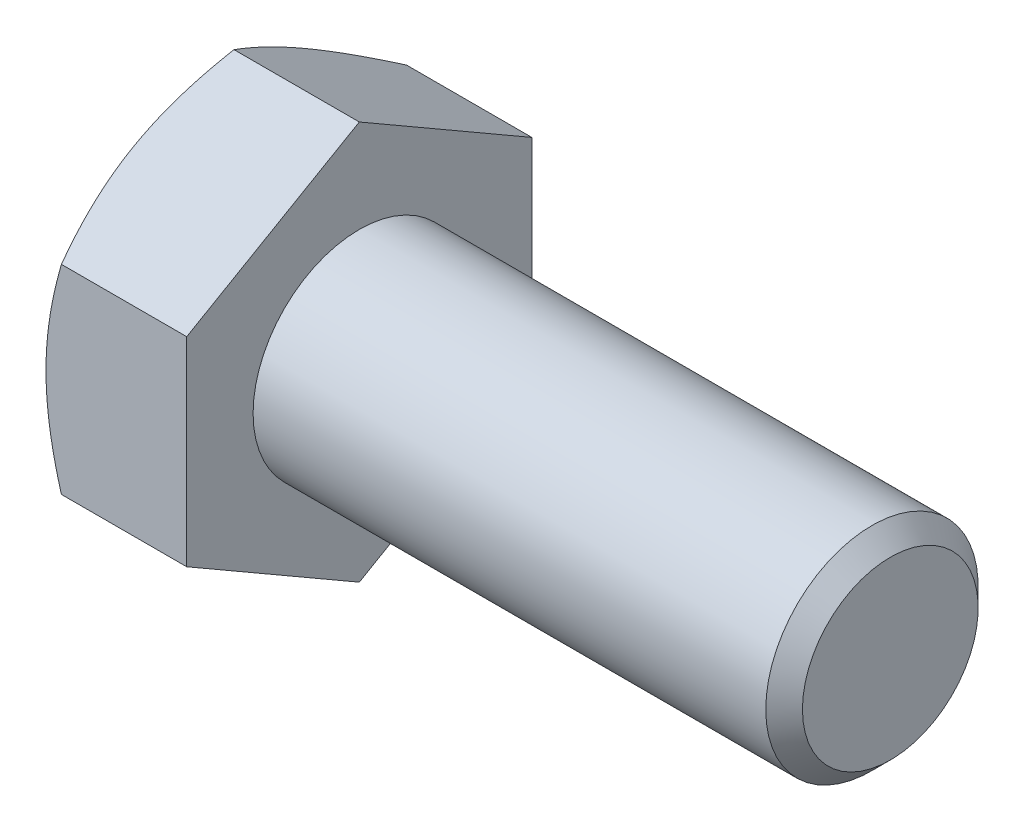
ISO-10303-21;
HEADER;
FILE_DESCRIPTION(('STEP AP214'),'2;1');
FILE_NAME('part.step','',(''),(''),'','','');
FILE_SCHEMA(('AUTOMOTIVE_DESIGN { 1 0 10303 214 1 1 1 1 }'));
ENDSEC;
DATA;
#1=APPLICATION_CONTEXT('core data for automotive mechanical design processes');
#2=APPLICATION_PROTOCOL_DEFINITION('international standard','automotive_design',2000,#1);
#3=PRODUCT_CONTEXT('',#1,'mechanical');
#4=PRODUCT('Part','Part','',(#3));
#5=PRODUCT_RELATED_PRODUCT_CATEGORY('part','',(#4));
#6=PRODUCT_DEFINITION_FORMATION('','',#4);
#7=PRODUCT_DEFINITION_CONTEXT('part definition',#1,'design');
#8=PRODUCT_DEFINITION('design','',#6,#7);
#9=PRODUCT_DEFINITION_SHAPE('','',#8);
#10=(LENGTH_UNIT() NAMED_UNIT(*) SI_UNIT(.MILLI.,.METRE.));
#11=(NAMED_UNIT(*) PLANE_ANGLE_UNIT() SI_UNIT($,.RADIAN.));
#12=(NAMED_UNIT(*) SI_UNIT($,.STERADIAN.) SOLID_ANGLE_UNIT());
#13=UNCERTAINTY_MEASURE_WITH_UNIT(LENGTH_MEASURE(1.E-05),#10,'distance_accuracy_value','');
#14=(GEOMETRIC_REPRESENTATION_CONTEXT(3) GLOBAL_UNCERTAINTY_ASSIGNED_CONTEXT((#13)) GLOBAL_UNIT_ASSIGNED_CONTEXT((#10,
#11,#12)) REPRESENTATION_CONTEXT('',''));
#15=CARTESIAN_POINT('',(0.,0.,0.));
#16=DIRECTION('',(0.,0.,1.));
#17=DIRECTION('',(1.,0.,0.));
#18=AXIS2_PLACEMENT_3D('',#15,#16,#17);
#19=CARTESIAN_POINT('',(5.3,3.75277674973256,-6.5));
#20=DIRECTION('',(0.,-0.866025403784438,0.500000000000001));
#21=DIRECTION('',(0.,-0.500000000000001,-0.866025403784438));
#22=AXIS2_PLACEMENT_3D('',#19,#20,#21);
#23=PLANE('',#22);
#24=CARTESIAN_POINT('',(0.580623251805871,7.50566896951898,0.0002));
#25=CARTESIAN_POINT('',(0.533004423075489,7.4231786300702,-0.14267745905888));
#26=CARTESIAN_POINT('',(0.48754670060271,7.34038072665459,-0.286087634534912));
#27=CARTESIAN_POINT('',(0.401548682023049,7.17411251123976,-0.574072631317194));
#28=CARTESIAN_POINT('',(0.361010507228028,7.09064192560665,-0.718647926571263));
#29=CARTESIAN_POINT('',(0.247571001123211,6.83889369625719,-1.15468865052003));
#30=CARTESIAN_POINT('',(0.183047807128741,6.66962231516081,-1.44787528284632));
#31=CARTESIAN_POINT('',(0.107386583547493,6.41631077211555,-1.88662374554437));
#32=CARTESIAN_POINT('',(0.0858328564569893,6.33302748139455,-2.03087463649469));
#33=CARTESIAN_POINT('',(0.0496903146061205,6.16608458377293,-2.32002821713809));
#34=CARTESIAN_POINT('',(0.0351008844596677,6.08242501078143,-2.46493084809889));
#35=CARTESIAN_POINT('',(0.0132587525073475,5.91496056339807,-2.75498777942832));
#36=CARTESIAN_POINT('',(0.00599772432210858,5.8311559625217,-2.90014160605421));
#37=CARTESIAN_POINT('',(-0.00103969741776807,5.66347396979287,-3.19057533697495));
#38=CARTESIAN_POINT('',(-0.000816322187795094,5.5795965802691,-3.33585523723636));
#39=CARTESIAN_POINT('',(0.010083458515165,5.34979921898453,-3.73387594242649));
#40=CARTESIAN_POINT('',(0.028381817869413,5.20395446807007,-3.98648646102757));
#41=CARTESIAN_POINT('',(0.0864063414576745,4.91323365606635,-4.49002967823568));
#42=CARTESIAN_POINT('',(0.126152338538244,4.76835861741226,-4.74096060593308));
#43=CARTESIAN_POINT('',(0.225505903202148,4.47705272008731,-5.24551722064432));
#44=CARTESIAN_POINT('',(0.285534425638025,4.33065861912702,-5.49907924143591));
#45=CARTESIAN_POINT('',(0.421774992509866,4.04005357906493,-6.00242193575904));
#46=CARTESIAN_POINT('',(0.49795503416359,3.89583891821181,-6.25220905555296));
#47=CARTESIAN_POINT('',(0.580623251805864,3.75266127967872,-6.5002));
#48=B_SPLINE_CURVE_WITH_KNOTS('',3,(#24,#25,#26,#27,#28,#29,#30,#31,#32,#33,#34,#35,#36,#37,#38,
#39,#40,#41,#42,#43,#44,#45,#46,#47),.UNSPECIFIED.,.F.,.F.,(4,2,2,2,2,2,2,2,2,2,2,4),(0.,
0.515105052395588,1.03043143507525,2.06322554824262,2.56697389547997,3.07067772176454,
3.57380860368928,4.0769239424252,4.9527935470566,5.82947446853467,6.72559912449737,
7.61996451221046),.UNSPECIFIED.);
#49=CARTESIAN_POINT('',(0.580556583600767,7.50555349946514,0.));
#50=VERTEX_POINT('',#49);
#51=CARTESIAN_POINT('',(0.,5.62916512459884,-3.25000000000001));
#52=VERTEX_POINT('',#51);
#53=EDGE_CURVE('E51',#50,#52,#48,.T.);
#54=ORIENTED_EDGE('',*,*,#53,.F.);
#55=DIRECTION('',(-1.,0.,0.));
#56=VECTOR('',#55,1.);
#57=CARTESIAN_POINT('',(5.3,7.50555349946514,0.));
#58=LINE('',#57,#56);
#59=CARTESIAN_POINT('',(5.3,7.50555349946514,0.));
#60=VERTEX_POINT('',#59);
#61=EDGE_CURVE('E147',#60,#50,#58,.T.);
#62=ORIENTED_EDGE('',*,*,#61,.F.);
#63=DIRECTION('',(0.,0.500000000000001,0.866025403784438));
#64=VECTOR('',#63,1.);
#65=CARTESIAN_POINT('',(5.3,3.75277674973256,-6.5));
#66=LINE('',#65,#64);
#67=CARTESIAN_POINT('',(5.3,3.75277674973256,-6.5));
#68=VERTEX_POINT('',#67);
#69=EDGE_CURVE('E238',#68,#60,#66,.T.);
#70=ORIENTED_EDGE('',*,*,#69,.F.);
#71=DIRECTION('',(-1.,0.,0.));
#72=VECTOR('',#71,1.);
#73=CARTESIAN_POINT('',(5.3,3.75277674973256,-6.5));
#74=LINE('',#73,#72);
#75=CARTESIAN_POINT('',(0.580556583600761,3.75277674973256,-6.5));
#76=VERTEX_POINT('',#75);
#77=EDGE_CURVE('E135',#68,#76,#74,.T.);
#78=ORIENTED_EDGE('',*,*,#77,.T.);
#79=EDGE_CURVE('E129',#52,#76,#48,.T.);
#80=ORIENTED_EDGE('',*,*,#79,.F.);
#81=EDGE_LOOP('',(#54,#62,#70,#78,#80));
#82=FACE_BOUND('',#81,.T.);
#83=ADVANCED_FACE('F35',(#82),#23,.F.);
#84=CARTESIAN_POINT('',(5.3,7.50555349946514,0.));
#85=DIRECTION('',(0.,-0.866025403784438,-0.500000000000001));
#86=DIRECTION('',(0.,0.500000000000001,-0.866025403784438));
#87=AXIS2_PLACEMENT_3D('',#84,#85,#86);
#88=PLANE('',#87);
#89=CARTESIAN_POINT('',(0.580623251805867,3.75266127967873,6.5002));
#90=CARTESIAN_POINT('',(0.533004423075485,3.83515161912751,6.35732254094112));
#91=CARTESIAN_POINT('',(0.487546700602706,3.91794952254312,6.21391236546508));
#92=CARTESIAN_POINT('',(0.401548682023045,4.08421773795795,5.9259273686828));
#93=CARTESIAN_POINT('',(0.361010507228025,4.16768832359106,5.78135207342873));
#94=CARTESIAN_POINT('',(0.247571001123208,4.41943655294052,5.34531134947996));
#95=CARTESIAN_POINT('',(0.18304780712874,4.5887079340369,5.05212471715368));
#96=CARTESIAN_POINT('',(0.107386583547492,4.84201947708216,4.61337625445562));
#97=CARTESIAN_POINT('',(0.0858328564569885,4.92530276780316,4.46912536350531));
#98=CARTESIAN_POINT('',(0.0496903146061203,5.09224566542477,4.17997178286191));
#99=CARTESIAN_POINT('',(0.0351008844596681,5.17590523841628,4.03506915190111));
#100=CARTESIAN_POINT('',(0.0132587525073484,5.34336968579964,3.74501222057168));
#101=CARTESIAN_POINT('',(0.00599772432210927,5.427174286676,3.59985839394579));
#102=CARTESIAN_POINT('',(-0.00103969741776701,5.59485627940484,3.30942466302505));
#103=CARTESIAN_POINT('',(-0.000816322187793485,5.67873366892861,3.16414476276364));
#104=CARTESIAN_POINT('',(0.0100834585151677,5.90853103021318,2.76612405757351));
#105=CARTESIAN_POINT('',(0.0283818178694159,6.05437578112764,2.51351353897243));
#106=CARTESIAN_POINT('',(0.086406341457678,6.34509659313135,2.00997032176432));
#107=CARTESIAN_POINT('',(0.126152338538248,6.48997163178545,1.75903939406692));
#108=CARTESIAN_POINT('',(0.225505903202153,6.78127752911039,1.25448277935568));
#109=CARTESIAN_POINT('',(0.28553442563803,6.92767163007068,1.00092075856409));
#110=CARTESIAN_POINT('',(0.421774992509872,7.21827667013277,0.497578064240955));
#111=CARTESIAN_POINT('',(0.497955034163597,7.36249133098589,0.247790944447036));
#112=CARTESIAN_POINT('',(0.580623251805871,7.50566896951898,-0.000200000000000136));
#113=B_SPLINE_CURVE_WITH_KNOTS('',3,(#89,#90,#91,#92,#93,#94,#95,#96,#97,#98,#99,#100,#101,#102,
#103,#104,#105,#106,#107,#108,#109,#110,#111,#112),.UNSPECIFIED.,.F.,.F.,(4,2,2,2,2,2,2,2,2,2,2,
4),(0.,0.515105052395588,1.03043143507524,2.06322554824262,2.56697389547996,3.07067772176454,
3.57380860368928,4.0769239424252,4.9527935470566,5.82947446853466,6.72559912449736,
7.61996451221046),.UNSPECIFIED.);
#114=CARTESIAN_POINT('',(0.580556583600762,3.75277674973257,6.5));
#115=VERTEX_POINT('',#114);
#116=CARTESIAN_POINT('',(0.,5.62916512459885,3.25));
#117=VERTEX_POINT('',#116);
#118=EDGE_CURVE('E58',#115,#117,#113,.T.);
#119=ORIENTED_EDGE('',*,*,#118,.F.);
#120=DIRECTION('',(-1.,0.,0.));
#121=VECTOR('',#120,1.);
#122=CARTESIAN_POINT('',(5.3,3.75277674973257,6.5));
#123=LINE('',#122,#121);
#124=CARTESIAN_POINT('',(5.3,3.75277674973257,6.5));
#125=VERTEX_POINT('',#124);
#126=EDGE_CURVE('E145',#125,#115,#123,.T.);
#127=ORIENTED_EDGE('',*,*,#126,.F.);
#128=DIRECTION('',(0.,-0.500000000000001,0.866025403784438));
#129=VECTOR('',#128,1.);
#130=CARTESIAN_POINT('',(5.3,7.50555349946514,0.));
#131=LINE('',#130,#129);
#132=EDGE_CURVE('E236',#60,#125,#131,.T.);
#133=ORIENTED_EDGE('',*,*,#132,.F.);
#134=ORIENTED_EDGE('',*,*,#61,.T.);
#135=EDGE_CURVE('E162',#117,#50,#113,.T.);
#136=ORIENTED_EDGE('',*,*,#135,.F.);
#137=EDGE_LOOP('',(#119,#127,#133,#134,#136));
#138=FACE_BOUND('',#137,.T.);
#139=ADVANCED_FACE('F168',(#138),#88,.F.);
#140=CARTESIAN_POINT('',(5.3,3.75277674973257,6.5));
#141=DIRECTION('',(0.,0.,-1.));
#142=DIRECTION('',(0.,1.,0.));
#143=AXIS2_PLACEMENT_3D('',#140,#141,#142);
#144=PLANE('',#143);
#145=CARTESIAN_POINT('',(3.18835311590245,-10.1137456678934,6.5));
#146=CARTESIAN_POINT('',(3.05034774010467,-9.82952666322136,6.5));
#147=CARTESIAN_POINT('',(2.91365616489937,-9.54465869649271,6.5));
#148=CARTESIAN_POINT('',(2.6436389949754,-8.97327978057919,6.5));
#149=CARTESIAN_POINT('',(2.51031392459096,-8.6867685838847,6.5));
#150=CARTESIAN_POINT('',(2.24710473482718,-8.11029837842687,6.5));
#151=CARTESIAN_POINT('',(2.11724300438679,-7.82032911201509,6.5));
#152=CARTESIAN_POINT('',(1.86279082826902,-7.23809541022337,6.5));
#153=CARTESIAN_POINT('',(1.73820013554673,-6.94583108317205,6.5));
#154=CARTESIAN_POINT('',(1.49176685426961,-6.34906440963034,6.5));
#155=CARTESIAN_POINT('',(1.37014257641265,-6.0444714228887,6.5));
#156=CARTESIAN_POINT('',(1.13601865758149,-5.43173420957314,6.5));
#157=CARTESIAN_POINT('',(1.02352003558022,-5.12358959079844,6.5));
#158=CARTESIAN_POINT('',(0.810575368239912,-4.50382569782258,6.5));
#159=CARTESIAN_POINT('',(0.710105232302,-4.19221478266991,6.5));
#160=CARTESIAN_POINT('',(0.524420166144449,-3.5645201920601,6.5));
#161=CARTESIAN_POINT('',(0.439200468206413,-3.24843794792919,6.5));
#162=CARTESIAN_POINT('',(0.288524223401194,-2.61335465712781,6.5));
#163=CARTESIAN_POINT('',(0.222961865744746,-2.29437912059504,6.5));
#164=CARTESIAN_POINT('',(0.115312883130723,-1.65238219405861,6.5));
#165=CARTESIAN_POINT('',(0.0732239014690612,-1.32936121354428,6.5));
#166=CARTESIAN_POINT('',(0.0304887136381653,-0.845231171839969,6.5));
#167=CARTESIAN_POINT('',(0.0196493434273836,-0.684982209663087,6.5));
#168=CARTESIAN_POINT('',(0.00475298486143972,-0.364162349065445,6.5));
#169=CARTESIAN_POINT('',(0.000695882908831872,-0.203591456081864,6.5));
#170=CARTESIAN_POINT('',(-0.000531597190094818,0.117577430374312,6.5));
#171=CARTESIAN_POINT('',(0.00229809017012758,0.278175424090158,6.5));
#172=CARTESIAN_POINT('',(0.0147726845547651,0.59910897282352,6.5));
#173=CARTESIAN_POINT('',(0.0244179260500531,0.759444514574232,6.5));
#174=CARTESIAN_POINT('',(0.0554961939343016,1.14369946602535,6.5));
#175=CARTESIAN_POINT('',(0.0801030490514534,1.36736763045088,6.5));
#176=CARTESIAN_POINT('',(0.14124653745338,1.81305591311689,6.5));
#177=CARTESIAN_POINT('',(0.177784759614455,2.0350758078311,6.5));
#178=CARTESIAN_POINT('',(0.303360001332119,2.69839633433797,6.5));
#179=CARTESIAN_POINT('',(0.408335815147599,3.13672010374359,6.5));
#180=CARTESIAN_POINT('',(0.590564593134946,3.7923211291812,6.5));
#181=CARTESIAN_POINT('',(0.656313198979097,4.01299150874075,6.5));
#182=CARTESIAN_POINT('',(0.794681634200738,4.45218859008393,6.5));
#183=CARTESIAN_POINT('',(0.867301513122623,4.67071527639821,6.5));
#184=CARTESIAN_POINT('',(1.01824353854296,5.10569490252728,6.5));
#185=CARTESIAN_POINT('',(1.0965638823284,5.32214847365078,6.5));
#186=CARTESIAN_POINT('',(1.25798086164822,5.75325725773041,6.5));
#187=CARTESIAN_POINT('',(1.34107741035996,5.96791250329558,6.5));
#188=CARTESIAN_POINT('',(1.56029019583042,6.51888445936375,6.5));
#189=CARTESIAN_POINT('',(1.69936356666535,6.85402316813629,6.5));
#190=CARTESIAN_POINT('',(1.98501958087354,7.52109583939395,6.5));
#191=CARTESIAN_POINT('',(2.13160288780792,7.85302951559935,6.5));
#192=CARTESIAN_POINT('',(2.43059748044952,8.5143786551866,6.5));
#193=CARTESIAN_POINT('',(2.5830105759696,8.84379329784095,6.5));
#194=CARTESIAN_POINT('',(2.89234869374927,9.50047798683786,6.5));
#195=CARTESIAN_POINT('',(3.04927357220059,9.82774810112759,6.49999999999999));
#196=CARTESIAN_POINT('',(3.36692013130637,10.4809971975748,6.49999999999999));
#197=CARTESIAN_POINT('',(3.52764676491734,10.8069737667408,6.49999999999999));
#198=CARTESIAN_POINT('',(3.851985555549,11.4574882901034,6.49999999999999));
#199=CARTESIAN_POINT('',(4.01559773123066,11.7820262349792,6.49999999999999));
#200=CARTESIAN_POINT('',(4.50986185003774,12.7537468114441,6.49999999999999));
#201=CARTESIAN_POINT('',(4.84399997978541,13.3991555932469,6.49999999999999));
#202=CARTESIAN_POINT('',(5.4857599026592,14.6239779290894,6.49999999999999));
#203=CARTESIAN_POINT('',(5.79279643372279,15.2036995760604,6.49999999999999));
#204=CARTESIAN_POINT('',(6.4106918822763,16.3611382637875,6.49999999999999));
#205=CARTESIAN_POINT('',(6.72155099010109,16.938855202873,6.49999999999999));
#206=CARTESIAN_POINT('',(7.34519775439015,18.0910273555999,6.49999999999999));
#207=CARTESIAN_POINT('',(7.65797694168864,18.665487160613,6.49999999999999));
#208=CARTESIAN_POINT('',(8.28574397153078,19.8131486204439,6.49999999999999));
#209=CARTESIAN_POINT('',(8.60073166294279,20.3863503578957,6.49999999999999));
#210=CARTESIAN_POINT('',(8.91652967168741,20.9591024521449,6.49999999999999));
#211=B_SPLINE_CURVE_WITH_KNOTS('',3,(#145,#146,#147,#148,#149,#150,#151,#152,#153,#154,#155,
#156,#157,#158,#159,#160,#161,#162,#163,#164,#165,#166,#167,#168,#169,#170,#171,#172,#173,#174,
#175,#176,#177,#178,#179,#180,#181,#182,#183,#184,#185,#186,#187,#188,#189,#190,#191,#192,#193,
#194,#195,#196,#197,#198,#199,#200,#201,#202,#203,#204,#205,#206,#207,#208,#209,#210),
.UNSPECIFIED.,.F.,.F.,(4,2,2,2,2,2,2,2,2,2,2,2,2,2,2,2,2,2,2,2,2,2,2,2,2,2,2,2,2,2,2,2,4),(0.,
0.947868666702312,1.89588406483492,2.84900320930536,3.80207763304314,4.7858977408271,
5.76982755141752,6.75175256246684,7.73337005764393,8.70960474890991,9.68574140951123,
10.1674651053568,10.6491807326436,11.1309009419855,11.6126447932157,12.287317572382,
12.9620802330383,14.312318438093,15.0030310344276,15.6937486114326,16.3842486973571,
17.0747362352244,18.1631508683747,19.2516618378194,20.3405135142583,21.4293305231019,
22.5196540547636,23.6099846401957,25.7902468235016,27.7582608872417,29.7263733429304,
31.6886408595598,33.6507753806319),.UNSPECIFIED.);
#212=CARTESIAN_POINT('',(0.58055658360076,-3.75277674973256,6.5));
#213=VERTEX_POINT('',#212);
#214=CARTESIAN_POINT('',(0.,0.,6.5));
#215=VERTEX_POINT('',#214);
#216=EDGE_CURVE('E248',#213,#215,#211,.T.);
#217=ORIENTED_EDGE('',*,*,#216,.F.);
#218=DIRECTION('',(-1.,0.,0.));
#219=VECTOR('',#218,1.);
#220=CARTESIAN_POINT('',(5.3,-3.75277674973256,6.5));
#221=LINE('',#220,#219);
#222=CARTESIAN_POINT('',(5.3,-3.75277674973256,6.5));
#223=VERTEX_POINT('',#222);
#224=EDGE_CURVE('E137',#223,#213,#221,.T.);
#225=ORIENTED_EDGE('',*,*,#224,.F.);
#226=DIRECTION('',(0.,-1.,0.));
#227=VECTOR('',#226,1.);
#228=CARTESIAN_POINT('',(5.3,3.75277674973257,6.5));
#229=LINE('',#228,#227);
#230=EDGE_CURVE('E232',#125,#223,#229,.T.);
#231=ORIENTED_EDGE('',*,*,#230,.F.);
#232=ORIENTED_EDGE('',*,*,#126,.T.);
#233=EDGE_CURVE('E186',#215,#115,#211,.T.);
#234=ORIENTED_EDGE('',*,*,#233,.F.);
#235=EDGE_LOOP('',(#217,#225,#231,#232,#234));
#236=FACE_BOUND('',#235,.T.);
#237=ADVANCED_FACE('F254',(#236),#144,.F.);
#238=CARTESIAN_POINT('',(5.3,-7.50555349946514,0.));
#239=DIRECTION('',(0.,0.866025403784438,-0.500000000000002));
#240=DIRECTION('',(0.,0.500000000000002,0.866025403784437));
#241=AXIS2_PLACEMENT_3D('',#238,#239,#240);
#242=PLANE('',#241);
#243=CARTESIAN_POINT('',(0.580623251805872,-7.50566896951898,-0.000200000000000038));
#244=CARTESIAN_POINT('',(0.533004423075489,-7.42317863007021,0.14267745905888));
#245=CARTESIAN_POINT('',(0.48754670060271,-7.34038072665459,0.286087634534913));
#246=CARTESIAN_POINT('',(0.401548682023049,-7.17411251123976,0.574072631317194));
#247=CARTESIAN_POINT('',(0.361010507228028,-7.09064192560666,0.718647926571263));
#248=CARTESIAN_POINT('',(0.247571001123211,-6.83889369625719,1.15468865052003));
#249=CARTESIAN_POINT('',(0.183047807128742,-6.66962231516081,1.44787528284632));
#250=CARTESIAN_POINT('',(0.107386583547493,-6.41631077211555,1.88662374554437));
#251=CARTESIAN_POINT('',(0.0858328564569885,-6.33302748139454,2.03087463649469));
#252=CARTESIAN_POINT('',(0.0496903146061194,-6.16608458377293,2.32002821713809));
#253=CARTESIAN_POINT('',(0.0351008844596669,-6.08242501078143,2.46493084809889));
#254=CARTESIAN_POINT('',(0.013258752507347,-5.91496056339806,2.75498777942832));
#255=CARTESIAN_POINT('',(0.00599772432210793,-5.8311559625217,2.90014160605421));
#256=CARTESIAN_POINT('',(-0.00103969741776893,-5.66347396979287,3.19057533697495));
#257=CARTESIAN_POINT('',(-0.000816322187795996,-5.5795965802691,3.33585523723636));
#258=CARTESIAN_POINT('',(0.0100834585151638,-5.34979921898453,3.73387594242649));
#259=CARTESIAN_POINT('',(0.0283818178694115,-5.20395446807006,3.98648646102757));
#260=CARTESIAN_POINT('',(0.0864063414576727,-4.91323365606635,4.49002967823568));
#261=CARTESIAN_POINT('',(0.126152338538242,-4.76835861741225,4.74096060593308));
#262=CARTESIAN_POINT('',(0.225505903202146,-4.47705272008731,5.24551722064432));
#263=CARTESIAN_POINT('',(0.285534425638023,-4.33065861912702,5.49907924143591));
#264=CARTESIAN_POINT('',(0.421774992509865,-4.04005357906493,6.00242193575904));
#265=CARTESIAN_POINT('',(0.497955034163589,-3.8958389182118,6.25220905555296));
#266=CARTESIAN_POINT('',(0.580623251805863,-3.75266127967872,6.5002));
#267=B_SPLINE_CURVE_WITH_KNOTS('',3,(#243,#244,#245,#246,#247,#248,#249,#250,#251,#252,#253,
#254,#255,#256,#257,#258,#259,#260,#261,#262,#263,#264,#265,#266),.UNSPECIFIED.,.F.,.F.,(4,2,2,
2,2,2,2,2,2,2,2,4),(0.,0.515105052395588,1.03043143507525,2.06322554824263,2.56697389547997,
3.07067772176454,3.57380860368928,4.0769239424252,4.95279354705661,5.82947446853467,
6.72559912449737,7.61996451221047),.UNSPECIFIED.);
#268=CARTESIAN_POINT('',(0.580556583600767,-7.50555349946514,0.));
#269=VERTEX_POINT('',#268);
#270=CARTESIAN_POINT('',(0.,-5.62916512459884,3.25000000000001));
#271=VERTEX_POINT('',#270);
#272=EDGE_CURVE('E170',#269,#271,#267,.T.);
#273=ORIENTED_EDGE('',*,*,#272,.F.);
#274=DIRECTION('',(-1.,0.,0.));
#275=VECTOR('',#274,1.);
#276=CARTESIAN_POINT('',(5.3,-7.50555349946514,0.));
#277=LINE('',#276,#275);
#278=CARTESIAN_POINT('',(5.3,-7.50555349946514,0.));
#279=VERTEX_POINT('',#278);
#280=EDGE_CURVE('E134',#279,#269,#277,.T.);
#281=ORIENTED_EDGE('',*,*,#280,.F.);
#282=DIRECTION('',(0.,-0.500000000000002,-0.866025403784438));
#283=VECTOR('',#282,1.);
#284=CARTESIAN_POINT('',(5.3,-7.50555349946514,0.));
#285=LINE('',#284,#283);
#286=EDGE_CURVE('E230',#223,#279,#285,.T.);
#287=ORIENTED_EDGE('',*,*,#286,.F.);
#288=ORIENTED_EDGE('',*,*,#224,.T.);
#289=EDGE_CURVE('E172',#271,#213,#267,.T.);
#290=ORIENTED_EDGE('',*,*,#289,.F.);
#291=EDGE_LOOP('',(#273,#281,#287,#288,#290));
#292=FACE_BOUND('',#291,.T.);
#293=ADVANCED_FACE('F226',(#292),#242,.F.);
#294=CARTESIAN_POINT('',(5.3,-3.75277674973257,-6.5));
#295=DIRECTION('',(0.,0.866025403784439,0.5));
#296=DIRECTION('',(0.,-0.5,0.866025403784439));
#297=AXIS2_PLACEMENT_3D('',#294,#295,#296);
#298=PLANE('',#297);
#299=CARTESIAN_POINT('',(0.580623251805869,-3.75266127967874,-6.5002));
#300=CARTESIAN_POINT('',(0.533004423075488,-3.83515161912751,-6.35732254094112));
#301=CARTESIAN_POINT('',(0.487546700602708,-3.91794952254313,-6.21391236546509));
#302=CARTESIAN_POINT('',(0.401548682023048,-4.08421773795795,-5.9259273686828));
#303=CARTESIAN_POINT('',(0.361010507228027,-4.16768832359106,-5.78135207342873));
#304=CARTESIAN_POINT('',(0.24757100112321,-4.41943655294052,-5.34531134947996));
#305=CARTESIAN_POINT('',(0.183047807128741,-4.5887079340369,-5.05212471715368));
#306=CARTESIAN_POINT('',(0.107386583547494,-4.84201947708216,-4.61337625445563));
#307=CARTESIAN_POINT('',(0.0858328564569907,-4.92530276780317,-4.46912536350531));
#308=CARTESIAN_POINT('',(0.0496903146061226,-5.09224566542478,-4.17997178286191));
#309=CARTESIAN_POINT('',(0.0351008844596702,-5.17590523841628,-4.03506915190111));
#310=CARTESIAN_POINT('',(0.0132587525073503,-5.34336968579964,-3.74501222057168));
#311=CARTESIAN_POINT('',(0.00599772432211135,-5.42717428667601,-3.59985839394579));
#312=CARTESIAN_POINT('',(-0.00103969741776482,-5.59485627940484,-3.30942466302505));
#313=CARTESIAN_POINT('',(-0.000816322187791323,-5.67873366892861,-3.16414476276364));
#314=CARTESIAN_POINT('',(0.0100834585151694,-5.90853103021318,-2.7661240575735));
#315=CARTESIAN_POINT('',(0.028381817869417,-6.05437578112764,-2.51351353897243));
#316=CARTESIAN_POINT('',(0.0864063414576788,-6.34509659313135,-2.00997032176432));
#317=CARTESIAN_POINT('',(0.126152338538249,-6.48997163178545,-1.75903939406692));
#318=CARTESIAN_POINT('',(0.225505903202154,-6.78127752911039,-1.25448277935568));
#319=CARTESIAN_POINT('',(0.285534425638031,-6.92767163007068,-1.00092075856408));
#320=CARTESIAN_POINT('',(0.421774992509872,-7.21827667013277,-0.497578064240954));
#321=CARTESIAN_POINT('',(0.497955034163597,-7.36249133098589,-0.247790944447036));
#322=CARTESIAN_POINT('',(0.580623251805871,-7.50566896951898,0.00019999999999984));
#323=B_SPLINE_CURVE_WITH_KNOTS('',3,(#299,#300,#301,#302,#303,#304,#305,#306,#307,#308,#309,
#310,#311,#312,#313,#314,#315,#316,#317,#318,#319,#320,#321,#322),.UNSPECIFIED.,.F.,.F.,(4,2,2,
2,2,2,2,2,2,2,2,4),(0.,0.515105052395588,1.03043143507525,2.06322554824262,2.56697389547996,
3.07067772176454,3.57380860368928,4.0769239424252,4.9527935470566,5.82947446853466,
6.72559912449736,7.61996451221046),.UNSPECIFIED.);
#324=CARTESIAN_POINT('',(0.580556583600765,-3.75277674973257,-6.5));
#325=VERTEX_POINT('',#324);
#326=CARTESIAN_POINT('',(0.,-5.62916512459885,-3.25));
#327=VERTEX_POINT('',#326);
#328=EDGE_CURVE('E111',#325,#327,#323,.T.);
#329=ORIENTED_EDGE('',*,*,#328,.F.);
#330=DIRECTION('',(-1.,0.,0.));
#331=VECTOR('',#330,1.);
#332=CARTESIAN_POINT('',(5.3,-3.75277674973257,-6.5));
#333=LINE('',#332,#331);
#334=CARTESIAN_POINT('',(5.3,-3.75277674973257,-6.5));
#335=VERTEX_POINT('',#334);
#336=EDGE_CURVE('E125',#335,#325,#333,.T.);
#337=ORIENTED_EDGE('',*,*,#336,.F.);
#338=DIRECTION('',(0.,0.5,-0.866025403784439));
#339=VECTOR('',#338,1.);
#340=CARTESIAN_POINT('',(5.3,-3.75277674973257,-6.5));
#341=LINE('',#340,#339);
#342=EDGE_CURVE('E228',#279,#335,#341,.T.);
#343=ORIENTED_EDGE('',*,*,#342,.F.);
#344=ORIENTED_EDGE('',*,*,#280,.T.);
#345=EDGE_CURVE('E128',#327,#269,#323,.T.);
#346=ORIENTED_EDGE('',*,*,#345,.F.);
#347=EDGE_LOOP('',(#329,#337,#343,#344,#346));
#348=FACE_BOUND('',#347,.T.);
#349=ADVANCED_FACE('F123',(#348),#298,.F.);
#350=CARTESIAN_POINT('',(5.3,3.75277674973256,-6.5));
#351=DIRECTION('',(0.,0.,1.));
#352=DIRECTION('',(0.,-1.,0.));
#353=AXIS2_PLACEMENT_3D('',#350,#351,#352);
#354=PLANE('',#353);
#355=CARTESIAN_POINT('',(3.18835311590246,-10.1137456678934,-6.5));
#356=CARTESIAN_POINT('',(3.05034774010468,-9.82952666322138,-6.5));
#357=CARTESIAN_POINT('',(2.91365616489938,-9.54465869649274,-6.5));
#358=CARTESIAN_POINT('',(2.64363899497542,-8.97327978057922,-6.5));
#359=CARTESIAN_POINT('',(2.51031392459097,-8.68676858388472,-6.5));
#360=CARTESIAN_POINT('',(2.24710473482719,-8.11029837842689,-6.5));
#361=CARTESIAN_POINT('',(2.1172430043868,-7.82032911201512,-6.5));
#362=CARTESIAN_POINT('',(1.86279082826903,-7.2380954102234,-6.5));
#363=CARTESIAN_POINT('',(1.73820013554674,-6.94583108317207,-6.5));
#364=CARTESIAN_POINT('',(1.49176685426961,-6.34906440963036,-6.5));
#365=CARTESIAN_POINT('',(1.37014257641265,-6.04447142288872,-6.5));
#366=CARTESIAN_POINT('',(1.13601865758149,-5.43173420957316,-6.5));
#367=CARTESIAN_POINT('',(1.02352003558022,-5.12358959079846,-6.5));
#368=CARTESIAN_POINT('',(0.810575368239918,-4.5038256978226,-6.5));
#369=CARTESIAN_POINT('',(0.710105232302006,-4.19221478266993,-6.5));
#370=CARTESIAN_POINT('',(0.524420166144455,-3.56452019206012,-6.5));
#371=CARTESIAN_POINT('',(0.439200468206418,-3.24843794792921,-6.5));
#372=CARTESIAN_POINT('',(0.288524223401198,-2.61335465712783,-6.5));
#373=CARTESIAN_POINT('',(0.222961865744749,-2.29437912059505,-6.5));
#374=CARTESIAN_POINT('',(0.115312883130726,-1.65238219405862,-6.5));
#375=CARTESIAN_POINT('',(0.0732239014690637,-1.3293612135443,-6.5));
#376=CARTESIAN_POINT('',(0.0304887136381668,-0.845231171839984,-6.5));
#377=CARTESIAN_POINT('',(0.0196493434273847,-0.684982209663102,-6.5));
#378=CARTESIAN_POINT('',(0.00475298486144043,-0.364162349065459,-6.5));
#379=CARTESIAN_POINT('',(0.00069588290883258,-0.203591456081878,-6.5));
#380=CARTESIAN_POINT('',(-0.000531597190094534,0.117577430374299,-6.5));
#381=CARTESIAN_POINT('',(0.00229809017012741,0.278175424090145,-6.5));
#382=CARTESIAN_POINT('',(0.0147726845547644,0.599108972823507,-6.5));
#383=CARTESIAN_POINT('',(0.0244179260500523,0.759444514574219,-6.5));
#384=CARTESIAN_POINT('',(0.0554961939343006,1.14369946602534,-6.5));
#385=CARTESIAN_POINT('',(0.0801030490514523,1.36736763045086,-6.5));
#386=CARTESIAN_POINT('',(0.141246537453378,1.81305591311688,-6.5));
#387=CARTESIAN_POINT('',(0.177784759614453,2.03507580783108,-6.5));
#388=CARTESIAN_POINT('',(0.303360001332116,2.69839633433796,-6.5));
#389=CARTESIAN_POINT('',(0.408335815147596,3.13672010374357,-6.5));
#390=CARTESIAN_POINT('',(0.590564593134941,3.79232112918118,-6.5));
#391=CARTESIAN_POINT('',(0.656313198979092,4.01299150874073,-6.5));
#392=CARTESIAN_POINT('',(0.794681634200733,4.45218859008391,-6.5));
#393=CARTESIAN_POINT('',(0.867301513122619,4.67071527639819,-6.5));
#394=CARTESIAN_POINT('',(1.01824353854295,5.10569490252726,-6.5));
#395=CARTESIAN_POINT('',(1.09656388232839,5.32214847365076,-6.5));
#396=CARTESIAN_POINT('',(1.25798086164821,5.75325725773039,-6.5));
#397=CARTESIAN_POINT('',(1.34107741035996,5.96791250329556,-6.5));
#398=CARTESIAN_POINT('',(1.56029019583041,6.51888445936373,-6.5));
#399=CARTESIAN_POINT('',(1.69936356666534,6.85402316813627,-6.5));
#400=CARTESIAN_POINT('',(1.98501958087353,7.52109583939393,-6.5));
#401=CARTESIAN_POINT('',(2.13160288780792,7.85302951559933,-6.5));
#402=CARTESIAN_POINT('',(2.43059748044952,8.51437865518658,-6.5));
#403=CARTESIAN_POINT('',(2.58301057596959,8.84379329784094,-6.5));
#404=CARTESIAN_POINT('',(2.89234869374927,9.50047798683784,-6.5));
#405=CARTESIAN_POINT('',(3.04927357220059,9.82774810112757,-6.5));
#406=CARTESIAN_POINT('',(3.36692013130636,10.4809971975748,-6.5));
#407=CARTESIAN_POINT('',(3.52764676491733,10.8069737667408,-6.5));
#408=CARTESIAN_POINT('',(3.851985555549,11.4574882901034,-6.5));
#409=CARTESIAN_POINT('',(4.01559773123066,11.7820262349792,-6.5));
#410=CARTESIAN_POINT('',(4.50986185003774,12.7537468114441,-6.5));
#411=CARTESIAN_POINT('',(4.84399997978541,13.3991555932469,-6.5));
#412=CARTESIAN_POINT('',(5.4857599026592,14.6239779290894,-6.5));
#413=CARTESIAN_POINT('',(5.79279643372279,15.2036995760604,-6.5));
#414=CARTESIAN_POINT('',(6.4106918822763,16.3611382637875,-6.5));
#415=CARTESIAN_POINT('',(6.72155099010109,16.938855202873,-6.5));
#416=CARTESIAN_POINT('',(7.34519775439015,18.0910273555999,-6.5));
#417=CARTESIAN_POINT('',(7.65797694168864,18.665487160613,-6.5));
#418=CARTESIAN_POINT('',(8.28574397153078,19.8131486204439,-6.5));
#419=CARTESIAN_POINT('',(8.60073166294279,20.3863503578957,-6.5));
#420=CARTESIAN_POINT('',(8.91652967168741,20.9591024521449,-6.5));
#421=B_SPLINE_CURVE_WITH_KNOTS('',3,(#355,#356,#357,#358,#359,#360,#361,#362,#363,#364,#365,
#366,#367,#368,#369,#370,#371,#372,#373,#374,#375,#376,#377,#378,#379,#380,#381,#382,#383,#384,
#385,#386,#387,#388,#389,#390,#391,#392,#393,#394,#395,#396,#397,#398,#399,#400,#401,#402,#403,
#404,#405,#406,#407,#408,#409,#410,#411,#412,#413,#414,#415,#416,#417,#418,#419,#420),
.UNSPECIFIED.,.F.,.F.,(4,2,2,2,2,2,2,2,2,2,2,2,2,2,2,2,2,2,2,2,2,2,2,2,2,2,2,2,2,2,2,2,4),(0.,
0.947868666702312,1.89588406483492,2.84900320930536,3.80207763304314,4.7858977408271,
5.76982755141752,6.75175256246685,7.73337005764394,8.70960474890991,9.68574140951124,
10.1674651053568,10.6491807326436,11.1309009419855,11.6126447932157,12.287317572382,
12.9620802330384,14.312318438093,15.0030310344276,15.6937486114326,16.3842486973571,
17.0747362352244,18.1631508683747,19.2516618378194,20.3405135142583,21.4293305231019,
22.5196540547637,23.6099846401957,25.7902468235017,27.7582608872418,29.7263733429304,
31.6886408595598,33.6507753806319),.UNSPECIFIED.);
#422=CARTESIAN_POINT('',(0.,0.,-6.5));
#423=VERTEX_POINT('',#422);
#424=EDGE_CURVE('E117',#76,#423,#421,.F.);
#425=ORIENTED_EDGE('',*,*,#424,.F.);
#426=ORIENTED_EDGE('',*,*,#77,.F.);
#427=DIRECTION('',(0.,1.,0.));
#428=VECTOR('',#427,1.);
#429=CARTESIAN_POINT('',(5.3,3.75277674973256,-6.5));
#430=LINE('',#429,#428);
#431=EDGE_CURVE('E133',#335,#68,#430,.T.);
#432=ORIENTED_EDGE('',*,*,#431,.F.);
#433=ORIENTED_EDGE('',*,*,#336,.T.);
#434=EDGE_CURVE('E108',#423,#325,#421,.F.);
#435=ORIENTED_EDGE('',*,*,#434,.F.);
#436=EDGE_LOOP('',(#425,#426,#432,#433,#435));
#437=FACE_BOUND('',#436,.T.);
#438=ADVANCED_FACE('F131',(#437),#354,.F.);
#439=CARTESIAN_POINT('',(5.3,7.50555349946514,0.));
#440=DIRECTION('',(1.,0.,0.));
#441=DIRECTION('',(0.,0.,-1.));
#442=AXIS2_PLACEMENT_3D('',#439,#440,#441);
#443=PLANE('',#442);
#444=CARTESIAN_POINT('',(5.3,0.,0.));
#445=DIRECTION('',(1.,0.,0.));
#446=DIRECTION('',(0.,0.,-1.));
#447=AXIS2_PLACEMENT_3D('',#444,#445,#446);
#448=CIRCLE('',#447,4.);
#449=CARTESIAN_POINT('',(5.3,0.,-4.));
#450=VERTEX_POINT('',#449);
#451=EDGE_CURVE('E241',#450,#450,#448,.F.);
#452=ORIENTED_EDGE('',*,*,#451,.T.);
#453=EDGE_LOOP('',(#452));
#454=FACE_BOUND('',#453,.T.);
#455=ORIENTED_EDGE('',*,*,#69,.T.);
#456=ORIENTED_EDGE('',*,*,#132,.T.);
#457=ORIENTED_EDGE('',*,*,#230,.T.);
#458=ORIENTED_EDGE('',*,*,#286,.T.);
#459=ORIENTED_EDGE('',*,*,#342,.T.);
#460=ORIENTED_EDGE('',*,*,#431,.T.);
#461=EDGE_LOOP('',(#455,#456,#457,#458,#459,#460));
#462=FACE_BOUND('',#461,.T.);
#463=ADVANCED_FACE('F256',(#454,#462),#443,.T.);
#464=CARTESIAN_POINT('',(0.,0.,0.));
#465=DIRECTION('',(-1.,0.,0.));
#466=DIRECTION('',(0.,0.,1.));
#467=AXIS2_PLACEMENT_3D('',#464,#465,#466);
#468=CYLINDRICAL_SURFACE('',#467,4.);
#469=ORIENTED_EDGE('',*,*,#451,.F.);
#470=EDGE_LOOP('',(#469));
#471=FACE_BOUND('',#470,.T.);
#472=CARTESIAN_POINT('',(24.6095,0.,0.));
#473=DIRECTION('',(-1.,0.,0.));
#474=DIRECTION('',(0.,0.,1.));
#475=AXIS2_PLACEMENT_3D('',#472,#473,#474);
#476=CIRCLE('',#475,4.);
#477=CARTESIAN_POINT('',(24.6095,0.,4.));
#478=VERTEX_POINT('',#477);
#479=EDGE_CURVE('E244',#478,#478,#476,.T.);
#480=ORIENTED_EDGE('',*,*,#479,.T.);
#481=EDGE_LOOP('',(#480));
#482=FACE_BOUND('',#481,.T.);
#483=ADVANCED_FACE('F287',(#471,#482),#468,.T.);
#484=CARTESIAN_POINT('',(25.3,0.,0.));
#485=DIRECTION('',(-1.,0.,0.));
#486=DIRECTION('',(0.,0.,1.));
#487=AXIS2_PLACEMENT_3D('',#484,#485,#486);
#488=CONICAL_SURFACE('',#487,3.3095,0.785398163397443);
#489=ORIENTED_EDGE('',*,*,#479,.F.);
#490=EDGE_LOOP('',(#489));
#491=FACE_BOUND('',#490,.T.);
#492=CARTESIAN_POINT('',(25.3,0.,0.));
#493=DIRECTION('',(-1.,0.,0.));
#494=DIRECTION('',(0.,0.,1.));
#495=AXIS2_PLACEMENT_3D('',#492,#493,#494);
#496=CIRCLE('',#495,3.3095);
#497=CARTESIAN_POINT('',(25.3,0.,3.3095));
#498=VERTEX_POINT('',#497);
#499=EDGE_CURVE('E246',#498,#498,#496,.T.);
#500=ORIENTED_EDGE('',*,*,#499,.T.);
#501=EDGE_LOOP('',(#500));
#502=FACE_BOUND('',#501,.T.);
#503=ADVANCED_FACE('F290',(#491,#502),#488,.T.);
#504=CARTESIAN_POINT('',(25.3,0.,0.));
#505=DIRECTION('',(-1.,0.,0.));
#506=DIRECTION('',(0.,0.,1.));
#507=AXIS2_PLACEMENT_3D('',#504,#505,#506);
#508=PLANE('',#507);
#509=ORIENTED_EDGE('',*,*,#499,.F.);
#510=EDGE_LOOP('',(#509));
#511=FACE_BOUND('',#510,.T.);
#512=ADVANCED_FACE('F200',(#511),#508,.F.);
#513=CARTESIAN_POINT('',(0.,0.,0.));
#514=DIRECTION('',(1.,0.,0.));
#515=DIRECTION('',(0.,0.,-1.));
#516=AXIS2_PLACEMENT_3D('',#513,#514,#515);
#517=CONICAL_SURFACE('',#516,6.5,1.0471975511966);
#518=ORIENTED_EDGE('',*,*,#328,.T.);
#519=CARTESIAN_POINT('',(0.,0.,0.));
#520=DIRECTION('',(1.,0.,0.));
#521=DIRECTION('',(0.,0.,-1.));
#522=AXIS2_PLACEMENT_3D('',#519,#520,#521);
#523=CIRCLE('',#522,6.5);
#524=EDGE_CURVE('E39',#327,#423,#523,.T.);
#525=ORIENTED_EDGE('',*,*,#524,.T.);
#526=ORIENTED_EDGE('',*,*,#434,.T.);
#527=EDGE_LOOP('',(#518,#525,#526));
#528=FACE_BOUND('',#527,.T.);
#529=ADVANCED_FACE('F110',(#528),#517,.T.);
#530=ORIENTED_EDGE('',*,*,#272,.T.);
#531=EDGE_CURVE('E152',#271,#327,#523,.T.);
#532=ORIENTED_EDGE('',*,*,#531,.T.);
#533=ORIENTED_EDGE('',*,*,#345,.T.);
#534=EDGE_LOOP('',(#530,#532,#533));
#535=FACE_BOUND('',#534,.T.);
#536=ADVANCED_FACE('F199',(#535),#517,.T.);
#537=ORIENTED_EDGE('',*,*,#216,.T.);
#538=EDGE_CURVE('E153',#215,#271,#523,.T.);
#539=ORIENTED_EDGE('',*,*,#538,.T.);
#540=ORIENTED_EDGE('',*,*,#289,.T.);
#541=EDGE_LOOP('',(#537,#539,#540));
#542=FACE_BOUND('',#541,.T.);
#543=ADVANCED_FACE('F194',(#542),#517,.T.);
#544=ORIENTED_EDGE('',*,*,#233,.T.);
#545=ORIENTED_EDGE('',*,*,#118,.T.);
#546=CARTESIAN_POINT('',(0.,0.,0.));
#547=DIRECTION('',(-1.,0.,0.));
#548=DIRECTION('',(0.,0.,1.));
#549=AXIS2_PLACEMENT_3D('',#546,#547,#548);
#550=CIRCLE('',#549,6.5);
#551=EDGE_CURVE('E118',#215,#117,#550,.T.);
#552=ORIENTED_EDGE('',*,*,#551,.F.);
#553=EDGE_LOOP('',(#544,#545,#552));
#554=FACE_BOUND('',#553,.T.);
#555=ADVANCED_FACE('F198',(#554),#517,.T.);
#556=ORIENTED_EDGE('',*,*,#135,.T.);
#557=ORIENTED_EDGE('',*,*,#53,.T.);
#558=EDGE_CURVE('E44',#52,#117,#523,.T.);
#559=ORIENTED_EDGE('',*,*,#558,.T.);
#560=EDGE_LOOP('',(#556,#557,#559));
#561=FACE_BOUND('',#560,.T.);
#562=ADVANCED_FACE('F161',(#561),#517,.T.);
#563=ORIENTED_EDGE('',*,*,#79,.T.);
#564=ORIENTED_EDGE('',*,*,#424,.T.);
#565=EDGE_CURVE('E11',#423,#52,#523,.T.);
#566=ORIENTED_EDGE('',*,*,#565,.T.);
#567=EDGE_LOOP('',(#563,#564,#566));
#568=FACE_BOUND('',#567,.T.);
#569=ADVANCED_FACE('F259',(#568),#517,.T.);
#570=CARTESIAN_POINT('',(0.,7.50555349946514,0.));
#571=DIRECTION('',(1.,0.,0.));
#572=DIRECTION('',(0.,0.,-1.));
#573=AXIS2_PLACEMENT_3D('',#570,#571,#572);
#574=PLANE('',#573);
#575=ORIENTED_EDGE('',*,*,#565,.F.);
#576=ORIENTED_EDGE('',*,*,#524,.F.);
#577=ORIENTED_EDGE('',*,*,#531,.F.);
#578=ORIENTED_EDGE('',*,*,#538,.F.);
#579=ORIENTED_EDGE('',*,*,#551,.T.);
#580=ORIENTED_EDGE('',*,*,#558,.F.);
#581=EDGE_LOOP('',(#575,#576,#577,#578,#579,#580));
#582=FACE_BOUND('',#581,.T.);
#583=ADVANCED_FACE('F165',(#582),#574,.F.);
#584=CLOSED_SHELL('',(#83,#139,#237,#293,#349,#438,#463,#483,#503,#512,#529,#536,#543,#555,#562,
#569,#583));
#585=MANIFOLD_SOLID_BREP('B2',#584);
#586=ADVANCED_BREP_SHAPE_REPRESENTATION('',(#18,#585),#14);
#587=SHAPE_DEFINITION_REPRESENTATION(#9,#586);
ENDSEC;
END-ISO-10303-21;
